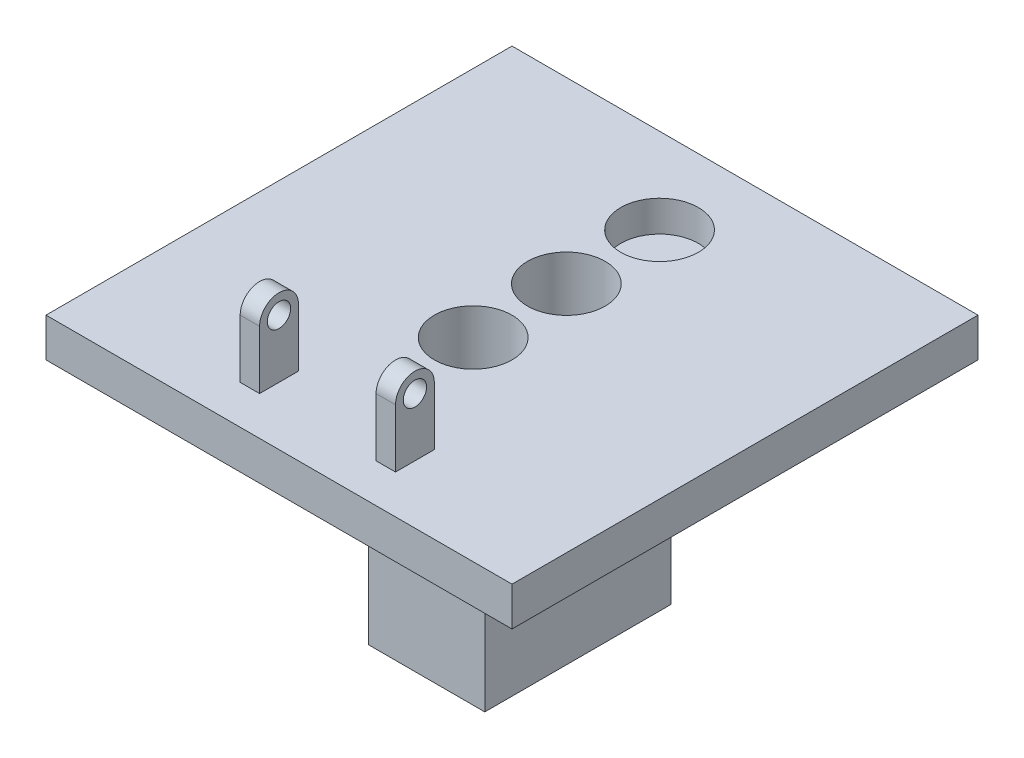
ISO-10303-21;
HEADER;
FILE_DESCRIPTION(('STEP AP214'),'2;1');
FILE_NAME('part.step','',(''),(''),'','','');
FILE_SCHEMA(('AUTOMOTIVE_DESIGN { 1 0 10303 214 1 1 1 1 }'));
ENDSEC;
DATA;
#1=APPLICATION_CONTEXT('core data for automotive mechanical design processes');
#2=APPLICATION_PROTOCOL_DEFINITION('international standard','automotive_design',2000,#1);
#3=PRODUCT_CONTEXT('',#1,'mechanical');
#4=PRODUCT('Part','Part','',(#3));
#5=PRODUCT_RELATED_PRODUCT_CATEGORY('part','',(#4));
#6=PRODUCT_DEFINITION_FORMATION('','',#4);
#7=PRODUCT_DEFINITION_CONTEXT('part definition',#1,'design');
#8=PRODUCT_DEFINITION('design','',#6,#7);
#9=PRODUCT_DEFINITION_SHAPE('','',#8);
#10=(LENGTH_UNIT() NAMED_UNIT(*) SI_UNIT(.MILLI.,.METRE.));
#11=(NAMED_UNIT(*) PLANE_ANGLE_UNIT() SI_UNIT($,.RADIAN.));
#12=(NAMED_UNIT(*) SI_UNIT($,.STERADIAN.) SOLID_ANGLE_UNIT());
#13=UNCERTAINTY_MEASURE_WITH_UNIT(LENGTH_MEASURE(1.E-05),#10,'distance_accuracy_value','');
#14=(GEOMETRIC_REPRESENTATION_CONTEXT(3) GLOBAL_UNCERTAINTY_ASSIGNED_CONTEXT((#13)) GLOBAL_UNIT_ASSIGNED_CONTEXT((#10,
#11,#12)) REPRESENTATION_CONTEXT('',''));
#15=CARTESIAN_POINT('',(0.,0.,0.));
#16=DIRECTION('',(0.,0.,1.));
#17=DIRECTION('',(1.,0.,0.));
#18=AXIS2_PLACEMENT_3D('',#15,#16,#17);
#19=CARTESIAN_POINT('',(0.,0.,0.));
#20=DIRECTION('',(0.,1.,0.));
#21=DIRECTION('',(0.,0.,1.));
#22=AXIS2_PLACEMENT_3D('',#19,#20,#21);
#23=PLANE('',#22);
#24=DIRECTION('',(0.,0.,-1.));
#25=VECTOR('',#24,1.);
#26=CARTESIAN_POINT('',(76.2,0.,-76.2));
#27=LINE('',#26,#25);
#28=CARTESIAN_POINT('',(76.2,0.,76.2));
#29=VERTEX_POINT('',#28);
#30=CARTESIAN_POINT('',(76.2,0.,-76.2));
#31=VERTEX_POINT('',#30);
#32=EDGE_CURVE('E238',#29,#31,#27,.T.);
#33=ORIENTED_EDGE('',*,*,#32,.F.);
#34=DIRECTION('',(1.,0.,0.));
#35=VECTOR('',#34,1.);
#36=CARTESIAN_POINT('',(-76.2,0.,76.2));
#37=LINE('',#36,#35);
#38=CARTESIAN_POINT('',(-76.2,0.,76.2));
#39=VERTEX_POINT('',#38);
#40=EDGE_CURVE('E243',#39,#29,#37,.T.);
#41=ORIENTED_EDGE('',*,*,#40,.F.);
#42=DIRECTION('',(0.,0.,1.));
#43=VECTOR('',#42,1.);
#44=CARTESIAN_POINT('',(-76.2,0.,-76.2));
#45=LINE('',#44,#43);
#46=CARTESIAN_POINT('',(-76.2,0.,-76.2));
#47=VERTEX_POINT('',#46);
#48=EDGE_CURVE('E254',#47,#39,#45,.T.);
#49=ORIENTED_EDGE('',*,*,#48,.F.);
#50=DIRECTION('',(-1.,0.,0.));
#51=VECTOR('',#50,1.);
#52=CARTESIAN_POINT('',(-76.2,0.,-76.2));
#53=LINE('',#52,#51);
#54=EDGE_CURVE('E252',#31,#47,#53,.T.);
#55=ORIENTED_EDGE('',*,*,#54,.F.);
#56=EDGE_LOOP('',(#33,#41,#49,#55));
#57=FACE_BOUND('',#56,.T.);
#58=DIRECTION('',(0.,0.,1.));
#59=VECTOR('',#58,1.);
#60=CARTESIAN_POINT('',(19.05,0.,0.));
#61=LINE('',#60,#59);
#62=CARTESIAN_POINT('',(19.05,0.,-33.02));
#63=VERTEX_POINT('',#62);
#64=CARTESIAN_POINT('',(19.05,0.,27.94));
#65=VERTEX_POINT('',#64);
#66=EDGE_CURVE('E55',#63,#65,#61,.T.);
#67=ORIENTED_EDGE('',*,*,#66,.F.);
#68=DIRECTION('',(1.,0.,0.));
#69=VECTOR('',#68,1.);
#70=CARTESIAN_POINT('',(0.,0.,-33.02));
#71=LINE('',#70,#69);
#72=CARTESIAN_POINT('',(-19.05,0.,-33.02));
#73=VERTEX_POINT('',#72);
#74=EDGE_CURVE('E164',#73,#63,#71,.T.);
#75=ORIENTED_EDGE('',*,*,#74,.F.);
#76=DIRECTION('',(0.,0.,1.));
#77=VECTOR('',#76,1.);
#78=CARTESIAN_POINT('',(-19.05,0.,0.));
#79=LINE('',#78,#77);
#80=CARTESIAN_POINT('',(-19.05,0.,27.94));
#81=VERTEX_POINT('',#80);
#82=EDGE_CURVE('E186',#73,#81,#79,.T.);
#83=ORIENTED_EDGE('',*,*,#82,.T.);
#84=DIRECTION('',(1.,0.,0.));
#85=VECTOR('',#84,1.);
#86=CARTESIAN_POINT('',(0.,0.,27.94));
#87=LINE('',#86,#85);
#88=EDGE_CURVE('E183',#81,#65,#87,.T.);
#89=ORIENTED_EDGE('',*,*,#88,.T.);
#90=EDGE_LOOP('',(#67,#75,#83,#89));
#91=FACE_BOUND('',#90,.T.);
#92=ADVANCED_FACE('F38',(#57,#91),#23,.F.);
#93=CARTESIAN_POINT('',(25.4,31.75,57.15));
#94=DIRECTION('',(-1.,0.,0.));
#95=DIRECTION('',(0.,0.,1.));
#96=AXIS2_PLACEMENT_3D('',#93,#94,#95);
#97=CYLINDRICAL_SURFACE('',#96,6.35);
#98=CARTESIAN_POINT('',(-19.05,31.75,57.15));
#99=DIRECTION('',(-1.,0.,0.));
#100=DIRECTION('',(0.,0.,1.));
#101=AXIS2_PLACEMENT_3D('',#98,#99,#100);
#102=CIRCLE('',#101,6.35);
#103=CARTESIAN_POINT('',(-19.05,31.75,50.8));
#104=VERTEX_POINT('',#103);
#105=CARTESIAN_POINT('',(-19.05,31.75,63.5));
#106=VERTEX_POINT('',#105);
#107=EDGE_CURVE('E212',#104,#106,#102,.F.);
#108=ORIENTED_EDGE('',*,*,#107,.F.);
#109=DIRECTION('',(-1.,0.,0.));
#110=VECTOR('',#109,1.);
#111=CARTESIAN_POINT('',(25.4,31.75,50.8));
#112=LINE('',#111,#110);
#113=CARTESIAN_POINT('',(-25.4,31.75,50.8));
#114=VERTEX_POINT('',#113);
#115=EDGE_CURVE('E273',#114,#104,#112,.F.);
#116=ORIENTED_EDGE('',*,*,#115,.F.);
#117=CARTESIAN_POINT('',(-25.4,31.75,57.15));
#118=DIRECTION('',(-1.,0.,0.));
#119=DIRECTION('',(0.,0.,1.));
#120=AXIS2_PLACEMENT_3D('',#117,#118,#119);
#121=CIRCLE('',#120,6.35);
#122=CARTESIAN_POINT('',(-25.4,31.75,63.5));
#123=VERTEX_POINT('',#122);
#124=EDGE_CURVE('E278',#123,#114,#121,.T.);
#125=ORIENTED_EDGE('',*,*,#124,.F.);
#126=DIRECTION('',(-1.,0.,0.));
#127=VECTOR('',#126,1.);
#128=CARTESIAN_POINT('',(25.4,31.75,63.5));
#129=LINE('',#128,#127);
#130=EDGE_CURVE('E268',#106,#123,#129,.T.);
#131=ORIENTED_EDGE('',*,*,#130,.F.);
#132=EDGE_LOOP('',(#108,#116,#125,#131));
#133=FACE_BOUND('',#132,.T.);
#134=ADVANCED_FACE('F318',(#133),#97,.T.);
#135=CARTESIAN_POINT('',(25.4,12.7,63.5));
#136=DIRECTION('',(0.,0.,-1.));
#137=DIRECTION('',(-1.,0.,0.));
#138=AXIS2_PLACEMENT_3D('',#135,#136,#137);
#139=PLANE('',#138);
#140=DIRECTION('',(-1.,0.,0.));
#141=VECTOR('',#140,1.);
#142=CARTESIAN_POINT('',(25.4,12.7,63.5));
#143=LINE('',#142,#141);
#144=CARTESIAN_POINT('',(-19.05,12.7,63.5));
#145=VERTEX_POINT('',#144);
#146=CARTESIAN_POINT('',(-25.4,12.7,63.5));
#147=VERTEX_POINT('',#146);
#148=EDGE_CURVE('E235',#145,#147,#143,.T.);
#149=ORIENTED_EDGE('',*,*,#148,.F.);
#150=DIRECTION('',(0.,-1.,0.));
#151=VECTOR('',#150,1.);
#152=CARTESIAN_POINT('',(-19.05,12.7,63.5));
#153=LINE('',#152,#151);
#154=EDGE_CURVE('E202',#106,#145,#153,.T.);
#155=ORIENTED_EDGE('',*,*,#154,.F.);
#156=ORIENTED_EDGE('',*,*,#130,.T.);
#157=DIRECTION('',(0.,-1.,0.));
#158=VECTOR('',#157,1.);
#159=CARTESIAN_POINT('',(-25.4,12.7,63.5));
#160=LINE('',#159,#158);
#161=EDGE_CURVE('E214',#123,#147,#160,.T.);
#162=ORIENTED_EDGE('',*,*,#161,.T.);
#163=EDGE_LOOP('',(#149,#155,#156,#162));
#164=FACE_BOUND('',#163,.T.);
#165=ADVANCED_FACE('F324',(#164),#139,.F.);
#166=CARTESIAN_POINT('',(25.4,12.7,50.8));
#167=DIRECTION('',(0.,0.,1.));
#168=DIRECTION('',(1.,0.,0.));
#169=AXIS2_PLACEMENT_3D('',#166,#167,#168);
#170=PLANE('',#169);
#171=ORIENTED_EDGE('',*,*,#115,.T.);
#172=DIRECTION('',(0.,-1.,0.));
#173=VECTOR('',#172,1.);
#174=CARTESIAN_POINT('',(-19.05,12.7,50.8));
#175=LINE('',#174,#173);
#176=CARTESIAN_POINT('',(-19.05,12.7,50.8));
#177=VERTEX_POINT('',#176);
#178=EDGE_CURVE('E11',#104,#177,#175,.T.);
#179=ORIENTED_EDGE('',*,*,#178,.T.);
#180=DIRECTION('',(-1.,0.,0.));
#181=VECTOR('',#180,1.);
#182=CARTESIAN_POINT('',(25.4,12.7,50.8));
#183=LINE('',#182,#181);
#184=CARTESIAN_POINT('',(-25.4,12.7,50.8));
#185=VERTEX_POINT('',#184);
#186=EDGE_CURVE('E224',#177,#185,#183,.T.);
#187=ORIENTED_EDGE('',*,*,#186,.T.);
#188=DIRECTION('',(0.,1.,0.));
#189=VECTOR('',#188,1.);
#190=CARTESIAN_POINT('',(-25.4,12.7,50.8));
#191=LINE('',#190,#189);
#192=EDGE_CURVE('E218',#185,#114,#191,.T.);
#193=ORIENTED_EDGE('',*,*,#192,.T.);
#194=EDGE_LOOP('',(#171,#179,#187,#193));
#195=FACE_BOUND('',#194,.T.);
#196=ADVANCED_FACE('F361',(#195),#170,.F.);
#197=CARTESIAN_POINT('',(19.05,31.75,57.15));
#198=DIRECTION('',(1.,0.,0.));
#199=DIRECTION('',(0.,0.,-1.));
#200=AXIS2_PLACEMENT_3D('',#197,#198,#199);
#201=CIRCLE('',#200,6.35);
#202=CARTESIAN_POINT('',(19.05,31.75,63.5));
#203=VERTEX_POINT('',#202);
#204=CARTESIAN_POINT('',(19.05,31.75,50.8));
#205=VERTEX_POINT('',#204);
#206=EDGE_CURVE('E208',#203,#205,#201,.F.);
#207=ORIENTED_EDGE('',*,*,#206,.F.);
#208=CARTESIAN_POINT('',(25.4,31.75,63.5));
#209=VERTEX_POINT('',#208);
#210=EDGE_CURVE('E269',#209,#203,#129,.T.);
#211=ORIENTED_EDGE('',*,*,#210,.F.);
#212=CARTESIAN_POINT('',(25.4,31.75,57.15));
#213=DIRECTION('',(-1.,0.,0.));
#214=DIRECTION('',(0.,0.,1.));
#215=AXIS2_PLACEMENT_3D('',#212,#213,#214);
#216=CIRCLE('',#215,6.35);
#217=CARTESIAN_POINT('',(25.4,31.75,50.8));
#218=VERTEX_POINT('',#217);
#219=EDGE_CURVE('E276',#218,#209,#216,.F.);
#220=ORIENTED_EDGE('',*,*,#219,.F.);
#221=EDGE_CURVE('E272',#205,#218,#112,.F.);
#222=ORIENTED_EDGE('',*,*,#221,.F.);
#223=EDGE_LOOP('',(#207,#211,#220,#222));
#224=FACE_BOUND('',#223,.T.);
#225=ADVANCED_FACE('F41',(#224),#97,.T.);
#226=CARTESIAN_POINT('',(0.,12.7,0.));
#227=DIRECTION('',(0.,1.,0.));
#228=DIRECTION('',(0.,0.,1.));
#229=AXIS2_PLACEMENT_3D('',#226,#227,#228);
#230=PLANE('',#229);
#231=CARTESIAN_POINT('',(0.,12.7,-48.26));
#232=DIRECTION('',(0.,1.,0.));
#233=DIRECTION('',(0.,0.,1.));
#234=AXIS2_PLACEMENT_3D('',#231,#232,#233);
#235=CIRCLE('',#234,12.7);
#236=CARTESIAN_POINT('',(0.,12.7,-35.56));
#237=VERTEX_POINT('',#236);
#238=EDGE_CURVE('E365',#237,#237,#235,.T.);
#239=ORIENTED_EDGE('',*,*,#238,.F.);
#240=EDGE_LOOP('',(#239));
#241=FACE_BOUND('',#240,.T.);
#242=CARTESIAN_POINT('',(0.,12.7,-17.78));
#243=DIRECTION('',(0.,1.,0.));
#244=DIRECTION('',(0.,0.,1.));
#245=AXIS2_PLACEMENT_3D('',#242,#243,#244);
#246=CIRCLE('',#245,12.7);
#247=CARTESIAN_POINT('',(0.,12.7,-5.08000000000002));
#248=VERTEX_POINT('',#247);
#249=EDGE_CURVE('E369',#248,#248,#246,.T.);
#250=ORIENTED_EDGE('',*,*,#249,.F.);
#251=EDGE_LOOP('',(#250));
#252=FACE_BOUND('',#251,.T.);
#253=CARTESIAN_POINT('',(0.,12.7,12.7));
#254=DIRECTION('',(0.,1.,0.));
#255=DIRECTION('',(0.,0.,1.));
#256=AXIS2_PLACEMENT_3D('',#253,#254,#255);
#257=CIRCLE('',#256,12.7);
#258=CARTESIAN_POINT('',(0.,12.7,25.4));
#259=VERTEX_POINT('',#258);
#260=EDGE_CURVE('E373',#259,#259,#257,.T.);
#261=ORIENTED_EDGE('',*,*,#260,.F.);
#262=EDGE_LOOP('',(#261));
#263=FACE_BOUND('',#262,.T.);
#264=ORIENTED_EDGE('',*,*,#186,.F.);
#265=DIRECTION('',(0.,0.,1.));
#266=VECTOR('',#265,1.);
#267=CARTESIAN_POINT('',(-19.05,12.7,12.7));
#268=LINE('',#267,#266);
#269=EDGE_CURVE('E206',#177,#145,#268,.T.);
#270=ORIENTED_EDGE('',*,*,#269,.T.);
#271=ORIENTED_EDGE('',*,*,#148,.T.);
#272=DIRECTION('',(0.,0.,-1.));
#273=VECTOR('',#272,1.);
#274=CARTESIAN_POINT('',(-25.4,12.7,63.5));
#275=LINE('',#274,#273);
#276=EDGE_CURVE('E227',#147,#185,#275,.T.);
#277=ORIENTED_EDGE('',*,*,#276,.T.);
#278=EDGE_LOOP('',(#264,#270,#271,#277));
#279=FACE_BOUND('',#278,.T.);
#280=DIRECTION('',(0.,0.,1.));
#281=VECTOR('',#280,1.);
#282=CARTESIAN_POINT('',(19.05,12.7,12.7));
#283=LINE('',#282,#281);
#284=CARTESIAN_POINT('',(19.05,12.7,50.8));
#285=VERTEX_POINT('',#284);
#286=CARTESIAN_POINT('',(19.05,12.7,63.5));
#287=VERTEX_POINT('',#286);
#288=EDGE_CURVE('E63',#285,#287,#283,.T.);
#289=ORIENTED_EDGE('',*,*,#288,.F.);
#290=CARTESIAN_POINT('',(25.4,12.7,50.8));
#291=VERTEX_POINT('',#290);
#292=EDGE_CURVE('E232',#291,#285,#183,.T.);
#293=ORIENTED_EDGE('',*,*,#292,.F.);
#294=DIRECTION('',(0.,0.,-1.));
#295=VECTOR('',#294,1.);
#296=CARTESIAN_POINT('',(25.4,12.7,63.5));
#297=LINE('',#296,#295);
#298=CARTESIAN_POINT('',(25.4,12.7,63.5));
#299=VERTEX_POINT('',#298);
#300=EDGE_CURVE('E217',#299,#291,#297,.T.);
#301=ORIENTED_EDGE('',*,*,#300,.F.);
#302=EDGE_CURVE('E236',#299,#287,#143,.T.);
#303=ORIENTED_EDGE('',*,*,#302,.T.);
#304=EDGE_LOOP('',(#289,#293,#301,#303));
#305=FACE_BOUND('',#304,.T.);
#306=DIRECTION('',(0.,0.,-1.));
#307=VECTOR('',#306,1.);
#308=CARTESIAN_POINT('',(76.2,12.7,-76.2));
#309=LINE('',#308,#307);
#310=CARTESIAN_POINT('',(76.2,12.7,76.2));
#311=VERTEX_POINT('',#310);
#312=CARTESIAN_POINT('',(76.2,12.7,-76.2));
#313=VERTEX_POINT('',#312);
#314=EDGE_CURVE('E239',#311,#313,#309,.T.);
#315=ORIENTED_EDGE('',*,*,#314,.T.);
#316=DIRECTION('',(-1.,0.,0.));
#317=VECTOR('',#316,1.);
#318=CARTESIAN_POINT('',(-76.2,12.7,-76.2));
#319=LINE('',#318,#317);
#320=CARTESIAN_POINT('',(-76.2,12.7,-76.2));
#321=VERTEX_POINT('',#320);
#322=EDGE_CURVE('E242',#313,#321,#319,.T.);
#323=ORIENTED_EDGE('',*,*,#322,.T.);
#324=DIRECTION('',(0.,0.,1.));
#325=VECTOR('',#324,1.);
#326=CARTESIAN_POINT('',(-76.2,12.7,-76.2));
#327=LINE('',#326,#325);
#328=CARTESIAN_POINT('',(-76.2,12.7,76.2));
#329=VERTEX_POINT('',#328);
#330=EDGE_CURVE('E245',#321,#329,#327,.T.);
#331=ORIENTED_EDGE('',*,*,#330,.T.);
#332=DIRECTION('',(1.,0.,0.));
#333=VECTOR('',#332,1.);
#334=CARTESIAN_POINT('',(-76.2,12.7,76.2));
#335=LINE('',#334,#333);
#336=EDGE_CURVE('E247',#329,#311,#335,.T.);
#337=ORIENTED_EDGE('',*,*,#336,.T.);
#338=EDGE_LOOP('',(#315,#323,#331,#337));
#339=FACE_BOUND('',#338,.T.);
#340=ADVANCED_FACE('F295',(#241,#252,#263,#279,#305,#339),#230,.T.);
#341=CARTESIAN_POINT('',(76.2,12.7,-76.2));
#342=DIRECTION('',(-1.,0.,0.));
#343=DIRECTION('',(0.,0.,1.));
#344=AXIS2_PLACEMENT_3D('',#341,#342,#343);
#345=PLANE('',#344);
#346=ORIENTED_EDGE('',*,*,#32,.T.);
#347=DIRECTION('',(0.,-1.,0.));
#348=VECTOR('',#347,1.);
#349=CARTESIAN_POINT('',(76.2,12.7,-76.2));
#350=LINE('',#349,#348);
#351=EDGE_CURVE('E265',#313,#31,#350,.T.);
#352=ORIENTED_EDGE('',*,*,#351,.F.);
#353=ORIENTED_EDGE('',*,*,#314,.F.);
#354=DIRECTION('',(0.,-1.,0.));
#355=VECTOR('',#354,1.);
#356=CARTESIAN_POINT('',(76.2,12.7,76.2));
#357=LINE('',#356,#355);
#358=EDGE_CURVE('E249',#311,#29,#357,.T.);
#359=ORIENTED_EDGE('',*,*,#358,.T.);
#360=EDGE_LOOP('',(#346,#352,#353,#359));
#361=FACE_BOUND('',#360,.T.);
#362=ADVANCED_FACE('F341',(#361),#345,.F.);
#363=CARTESIAN_POINT('',(-76.2,12.7,-76.2));
#364=DIRECTION('',(0.,0.,1.));
#365=DIRECTION('',(1.,0.,0.));
#366=AXIS2_PLACEMENT_3D('',#363,#364,#365);
#367=PLANE('',#366);
#368=ORIENTED_EDGE('',*,*,#54,.T.);
#369=DIRECTION('',(0.,-1.,0.));
#370=VECTOR('',#369,1.);
#371=CARTESIAN_POINT('',(-76.2,12.7,-76.2));
#372=LINE('',#371,#370);
#373=EDGE_CURVE('E262',#321,#47,#372,.T.);
#374=ORIENTED_EDGE('',*,*,#373,.F.);
#375=ORIENTED_EDGE('',*,*,#322,.F.);
#376=ORIENTED_EDGE('',*,*,#351,.T.);
#377=EDGE_LOOP('',(#368,#374,#375,#376));
#378=FACE_BOUND('',#377,.T.);
#379=ADVANCED_FACE('F338',(#378),#367,.F.);
#380=CARTESIAN_POINT('',(-76.2,12.7,-76.2));
#381=DIRECTION('',(1.,0.,0.));
#382=DIRECTION('',(0.,0.,-1.));
#383=AXIS2_PLACEMENT_3D('',#380,#381,#382);
#384=PLANE('',#383);
#385=ORIENTED_EDGE('',*,*,#48,.T.);
#386=DIRECTION('',(0.,-1.,0.));
#387=VECTOR('',#386,1.);
#388=CARTESIAN_POINT('',(-76.2,12.7,76.2));
#389=LINE('',#388,#387);
#390=EDGE_CURVE('E259',#329,#39,#389,.T.);
#391=ORIENTED_EDGE('',*,*,#390,.F.);
#392=ORIENTED_EDGE('',*,*,#330,.F.);
#393=ORIENTED_EDGE('',*,*,#373,.T.);
#394=EDGE_LOOP('',(#385,#391,#392,#393));
#395=FACE_BOUND('',#394,.T.);
#396=ADVANCED_FACE('F334',(#395),#384,.F.);
#397=CARTESIAN_POINT('',(-76.2,12.7,76.2));
#398=DIRECTION('',(0.,0.,-1.));
#399=DIRECTION('',(-1.,0.,0.));
#400=AXIS2_PLACEMENT_3D('',#397,#398,#399);
#401=PLANE('',#400);
#402=ORIENTED_EDGE('',*,*,#40,.T.);
#403=ORIENTED_EDGE('',*,*,#358,.F.);
#404=ORIENTED_EDGE('',*,*,#336,.F.);
#405=ORIENTED_EDGE('',*,*,#390,.T.);
#406=EDGE_LOOP('',(#402,#403,#404,#405));
#407=FACE_BOUND('',#406,.T.);
#408=ADVANCED_FACE('F331',(#407),#401,.F.);
#409=ORIENTED_EDGE('',*,*,#210,.T.);
#410=DIRECTION('',(0.,1.,0.));
#411=VECTOR('',#410,1.);
#412=CARTESIAN_POINT('',(19.05,12.7,63.5));
#413=LINE('',#412,#411);
#414=EDGE_CURVE('E204',#287,#203,#413,.T.);
#415=ORIENTED_EDGE('',*,*,#414,.F.);
#416=ORIENTED_EDGE('',*,*,#302,.F.);
#417=DIRECTION('',(0.,-1.,0.));
#418=VECTOR('',#417,1.);
#419=CARTESIAN_POINT('',(25.4,12.7,63.5));
#420=LINE('',#419,#418);
#421=EDGE_CURVE('E215',#209,#299,#420,.T.);
#422=ORIENTED_EDGE('',*,*,#421,.F.);
#423=EDGE_LOOP('',(#409,#415,#416,#422));
#424=FACE_BOUND('',#423,.T.);
#425=ADVANCED_FACE('F299',(#424),#139,.F.);
#426=ORIENTED_EDGE('',*,*,#292,.T.);
#427=DIRECTION('',(0.,1.,0.));
#428=VECTOR('',#427,1.);
#429=CARTESIAN_POINT('',(19.05,12.7,50.8));
#430=LINE('',#429,#428);
#431=EDGE_CURVE('E48',#285,#205,#430,.T.);
#432=ORIENTED_EDGE('',*,*,#431,.T.);
#433=ORIENTED_EDGE('',*,*,#221,.T.);
#434=DIRECTION('',(0.,1.,0.));
#435=VECTOR('',#434,1.);
#436=CARTESIAN_POINT('',(25.4,12.7,50.8));
#437=LINE('',#436,#435);
#438=EDGE_CURVE('E221',#291,#218,#437,.T.);
#439=ORIENTED_EDGE('',*,*,#438,.F.);
#440=EDGE_LOOP('',(#426,#432,#433,#439));
#441=FACE_BOUND('',#440,.T.);
#442=ADVANCED_FACE('F283',(#441),#170,.F.);
#443=CARTESIAN_POINT('',(25.4,0.,0.));
#444=DIRECTION('',(-1.,0.,0.));
#445=DIRECTION('',(0.,0.,1.));
#446=AXIS2_PLACEMENT_3D('',#443,#444,#445);
#447=PLANE('',#446);
#448=CARTESIAN_POINT('',(25.4,31.75,57.15));
#449=DIRECTION('',(1.,0.,0.));
#450=DIRECTION('',(0.,0.,-1.));
#451=AXIS2_PLACEMENT_3D('',#448,#449,#450);
#452=CIRCLE('',#451,3.81);
#453=CARTESIAN_POINT('',(25.4,31.75,53.34));
#454=VERTEX_POINT('',#453);
#455=EDGE_CURVE('E171',#454,#454,#452,.T.);
#456=ORIENTED_EDGE('',*,*,#455,.F.);
#457=EDGE_LOOP('',(#456));
#458=FACE_BOUND('',#457,.T.);
#459=ORIENTED_EDGE('',*,*,#438,.T.);
#460=ORIENTED_EDGE('',*,*,#219,.T.);
#461=ORIENTED_EDGE('',*,*,#421,.T.);
#462=ORIENTED_EDGE('',*,*,#300,.T.);
#463=EDGE_LOOP('',(#459,#460,#461,#462));
#464=FACE_BOUND('',#463,.T.);
#465=ADVANCED_FACE('F292',(#458,#464),#447,.F.);
#466=CARTESIAN_POINT('',(-25.4,0.,0.));
#467=DIRECTION('',(-1.,0.,0.));
#468=DIRECTION('',(0.,0.,1.));
#469=AXIS2_PLACEMENT_3D('',#466,#467,#468);
#470=PLANE('',#469);
#471=CARTESIAN_POINT('',(-25.4,31.75,57.15));
#472=DIRECTION('',(1.,0.,0.));
#473=DIRECTION('',(0.,0.,-1.));
#474=AXIS2_PLACEMENT_3D('',#471,#472,#473);
#475=CIRCLE('',#474,3.81);
#476=CARTESIAN_POINT('',(-25.4,31.75,53.34));
#477=VERTEX_POINT('',#476);
#478=EDGE_CURVE('E194',#477,#477,#475,.T.);
#479=ORIENTED_EDGE('',*,*,#478,.T.);
#480=EDGE_LOOP('',(#479));
#481=FACE_BOUND('',#480,.T.);
#482=ORIENTED_EDGE('',*,*,#161,.F.);
#483=ORIENTED_EDGE('',*,*,#124,.T.);
#484=ORIENTED_EDGE('',*,*,#192,.F.);
#485=ORIENTED_EDGE('',*,*,#276,.F.);
#486=EDGE_LOOP('',(#482,#483,#484,#485));
#487=FACE_BOUND('',#486,.T.);
#488=ADVANCED_FACE('F313',(#481,#487),#470,.T.);
#489=CARTESIAN_POINT('',(-19.05,12.7,12.7));
#490=DIRECTION('',(-1.,0.,0.));
#491=DIRECTION('',(0.,0.,1.));
#492=AXIS2_PLACEMENT_3D('',#489,#490,#491);
#493=PLANE('',#492);
#494=CARTESIAN_POINT('',(-19.05,31.75,57.15));
#495=DIRECTION('',(-1.,0.,0.));
#496=DIRECTION('',(0.,0.,1.));
#497=AXIS2_PLACEMENT_3D('',#494,#495,#496);
#498=CIRCLE('',#497,3.81);
#499=CARTESIAN_POINT('',(-19.05,31.75,60.96));
#500=VERTEX_POINT('',#499);
#501=EDGE_CURVE('E199',#500,#500,#498,.T.);
#502=ORIENTED_EDGE('',*,*,#501,.T.);
#503=EDGE_LOOP('',(#502));
#504=FACE_BOUND('',#503,.T.);
#505=ORIENTED_EDGE('',*,*,#107,.T.);
#506=ORIENTED_EDGE('',*,*,#154,.T.);
#507=ORIENTED_EDGE('',*,*,#269,.F.);
#508=ORIENTED_EDGE('',*,*,#178,.F.);
#509=EDGE_LOOP('',(#505,#506,#507,#508));
#510=FACE_BOUND('',#509,.T.);
#511=ADVANCED_FACE('F303',(#504,#510),#493,.F.);
#512=CARTESIAN_POINT('',(19.05,12.7,12.7));
#513=DIRECTION('',(1.,0.,0.));
#514=DIRECTION('',(0.,0.,-1.));
#515=AXIS2_PLACEMENT_3D('',#512,#513,#514);
#516=PLANE('',#515);
#517=CARTESIAN_POINT('',(19.05,31.75,57.15));
#518=DIRECTION('',(1.,0.,0.));
#519=DIRECTION('',(0.,0.,-1.));
#520=AXIS2_PLACEMENT_3D('',#517,#518,#519);
#521=CIRCLE('',#520,3.81);
#522=CARTESIAN_POINT('',(19.05,31.75,53.34));
#523=VERTEX_POINT('',#522);
#524=EDGE_CURVE('E43',#523,#523,#521,.T.);
#525=ORIENTED_EDGE('',*,*,#524,.T.);
#526=EDGE_LOOP('',(#525));
#527=FACE_BOUND('',#526,.T.);
#528=ORIENTED_EDGE('',*,*,#206,.T.);
#529=ORIENTED_EDGE('',*,*,#431,.F.);
#530=ORIENTED_EDGE('',*,*,#288,.T.);
#531=ORIENTED_EDGE('',*,*,#414,.T.);
#532=EDGE_LOOP('',(#528,#529,#530,#531));
#533=FACE_BOUND('',#532,.T.);
#534=ADVANCED_FACE('F300',(#527,#533),#516,.F.);
#535=CARTESIAN_POINT('',(-25.4,31.75,57.15));
#536=DIRECTION('',(1.,0.,0.));
#537=DIRECTION('',(0.,0.,-1.));
#538=AXIS2_PLACEMENT_3D('',#535,#536,#537);
#539=CYLINDRICAL_SURFACE('',#538,3.81);
#540=ORIENTED_EDGE('',*,*,#455,.T.);
#541=EDGE_LOOP('',(#540));
#542=FACE_BOUND('',#541,.T.);
#543=ORIENTED_EDGE('',*,*,#524,.F.);
#544=EDGE_LOOP('',(#543));
#545=FACE_BOUND('',#544,.T.);
#546=ADVANCED_FACE('F302',(#542,#545),#539,.F.);
#547=ORIENTED_EDGE('',*,*,#478,.F.);
#548=EDGE_LOOP('',(#547));
#549=FACE_BOUND('',#548,.T.);
#550=ORIENTED_EDGE('',*,*,#501,.F.);
#551=EDGE_LOOP('',(#550));
#552=FACE_BOUND('',#551,.T.);
#553=ADVANCED_FACE('F310',(#549,#552),#539,.F.);
#554=CARTESIAN_POINT('',(19.05,-76.2,0.));
#555=DIRECTION('',(-1.,0.,0.));
#556=DIRECTION('',(0.,0.,1.));
#557=AXIS2_PLACEMENT_3D('',#554,#555,#556);
#558=PLANE('',#557);
#559=ORIENTED_EDGE('',*,*,#66,.T.);
#560=DIRECTION('',(0.,1.,0.));
#561=VECTOR('',#560,1.);
#562=CARTESIAN_POINT('',(19.05,-76.2,27.94));
#563=LINE('',#562,#561);
#564=CARTESIAN_POINT('',(19.05,-76.2,27.94));
#565=VERTEX_POINT('',#564);
#566=EDGE_CURVE('E166',#565,#65,#563,.T.);
#567=ORIENTED_EDGE('',*,*,#566,.F.);
#568=DIRECTION('',(0.,0.,1.));
#569=VECTOR('',#568,1.);
#570=CARTESIAN_POINT('',(19.05,-76.2,0.));
#571=LINE('',#570,#569);
#572=CARTESIAN_POINT('',(19.05,-76.2,-33.02));
#573=VERTEX_POINT('',#572);
#574=EDGE_CURVE('E155',#573,#565,#571,.T.);
#575=ORIENTED_EDGE('',*,*,#574,.F.);
#576=DIRECTION('',(0.,1.,0.));
#577=VECTOR('',#576,1.);
#578=CARTESIAN_POINT('',(19.05,-76.2,-33.02));
#579=LINE('',#578,#577);
#580=EDGE_CURVE('E181',#573,#63,#579,.T.);
#581=ORIENTED_EDGE('',*,*,#580,.T.);
#582=EDGE_LOOP('',(#559,#567,#575,#581));
#583=FACE_BOUND('',#582,.T.);
#584=ADVANCED_FACE('F167',(#583),#558,.F.);
#585=CARTESIAN_POINT('',(0.,-76.2,27.94));
#586=DIRECTION('',(0.,0.,1.));
#587=DIRECTION('',(1.,0.,0.));
#588=AXIS2_PLACEMENT_3D('',#585,#586,#587);
#589=PLANE('',#588);
#590=ORIENTED_EDGE('',*,*,#88,.F.);
#591=DIRECTION('',(0.,1.,0.));
#592=VECTOR('',#591,1.);
#593=CARTESIAN_POINT('',(-19.05,-76.2,27.94));
#594=LINE('',#593,#592);
#595=CARTESIAN_POINT('',(-19.05,-76.2,27.94));
#596=VERTEX_POINT('',#595);
#597=EDGE_CURVE('E172',#596,#81,#594,.T.);
#598=ORIENTED_EDGE('',*,*,#597,.F.);
#599=DIRECTION('',(1.,0.,0.));
#600=VECTOR('',#599,1.);
#601=CARTESIAN_POINT('',(0.,-76.2,27.94));
#602=LINE('',#601,#600);
#603=EDGE_CURVE('E159',#596,#565,#602,.T.);
#604=ORIENTED_EDGE('',*,*,#603,.T.);
#605=ORIENTED_EDGE('',*,*,#566,.T.);
#606=EDGE_LOOP('',(#590,#598,#604,#605));
#607=FACE_BOUND('',#606,.T.);
#608=ADVANCED_FACE('F174',(#607),#589,.T.);
#609=CARTESIAN_POINT('',(-19.05,-76.2,0.));
#610=DIRECTION('',(-1.,0.,0.));
#611=DIRECTION('',(0.,0.,1.));
#612=AXIS2_PLACEMENT_3D('',#609,#610,#611);
#613=PLANE('',#612);
#614=ORIENTED_EDGE('',*,*,#82,.F.);
#615=DIRECTION('',(0.,1.,0.));
#616=VECTOR('',#615,1.);
#617=CARTESIAN_POINT('',(-19.05,-76.2,-33.02));
#618=LINE('',#617,#616);
#619=CARTESIAN_POINT('',(-19.05,-76.2,-33.02));
#620=VERTEX_POINT('',#619);
#621=EDGE_CURVE('E191',#620,#73,#618,.T.);
#622=ORIENTED_EDGE('',*,*,#621,.F.);
#623=DIRECTION('',(0.,0.,1.));
#624=VECTOR('',#623,1.);
#625=CARTESIAN_POINT('',(-19.05,-76.2,0.));
#626=LINE('',#625,#624);
#627=EDGE_CURVE('E175',#620,#596,#626,.T.);
#628=ORIENTED_EDGE('',*,*,#627,.T.);
#629=ORIENTED_EDGE('',*,*,#597,.T.);
#630=EDGE_LOOP('',(#614,#622,#628,#629));
#631=FACE_BOUND('',#630,.T.);
#632=ADVANCED_FACE('F478',(#631),#613,.T.);
#633=CARTESIAN_POINT('',(0.,-76.2,-33.02));
#634=DIRECTION('',(0.,0.,1.));
#635=DIRECTION('',(1.,0.,0.));
#636=AXIS2_PLACEMENT_3D('',#633,#634,#635);
#637=PLANE('',#636);
#638=ORIENTED_EDGE('',*,*,#74,.T.);
#639=ORIENTED_EDGE('',*,*,#580,.F.);
#640=DIRECTION('',(1.,0.,0.));
#641=VECTOR('',#640,1.);
#642=CARTESIAN_POINT('',(0.,-76.2,-33.02));
#643=LINE('',#642,#641);
#644=EDGE_CURVE('E162',#620,#573,#643,.T.);
#645=ORIENTED_EDGE('',*,*,#644,.F.);
#646=ORIENTED_EDGE('',*,*,#621,.T.);
#647=EDGE_LOOP('',(#638,#639,#645,#646));
#648=FACE_BOUND('',#647,.T.);
#649=ADVANCED_FACE('F487',(#648),#637,.F.);
#650=CARTESIAN_POINT('',(0.,-76.2,0.));
#651=DIRECTION('',(0.,-1.,0.));
#652=DIRECTION('',(0.,0.,-1.));
#653=AXIS2_PLACEMENT_3D('',#650,#651,#652);
#654=PLANE('',#653);
#655=ORIENTED_EDGE('',*,*,#574,.T.);
#656=ORIENTED_EDGE('',*,*,#603,.F.);
#657=ORIENTED_EDGE('',*,*,#627,.F.);
#658=ORIENTED_EDGE('',*,*,#644,.T.);
#659=EDGE_LOOP('',(#655,#656,#657,#658));
#660=FACE_BOUND('',#659,.T.);
#661=ADVANCED_FACE('F156',(#660),#654,.T.);
#662=CARTESIAN_POINT('',(0.,-63.5,12.7));
#663=DIRECTION('',(0.,1.,0.));
#664=DIRECTION('',(0.,0.,1.));
#665=AXIS2_PLACEMENT_3D('',#662,#663,#664);
#666=CYLINDRICAL_SURFACE('',#665,12.7);
#667=CARTESIAN_POINT('',(0.,-63.5,12.7));
#668=DIRECTION('',(0.,1.,0.));
#669=DIRECTION('',(0.,0.,1.));
#670=AXIS2_PLACEMENT_3D('',#667,#668,#669);
#671=CIRCLE('',#670,12.7);
#672=CARTESIAN_POINT('',(0.,-63.5,25.4));
#673=VERTEX_POINT('',#672);
#674=EDGE_CURVE('E579',#673,#673,#671,.T.);
#675=CARTESIAN_POINT('',(0.,-63.5,25.4));
#676=CARTESIAN_POINT('',(0.,-62.70625,25.4));
#677=CARTESIAN_POINT('',(0.,-61.9125,25.4));
#678=CARTESIAN_POINT('',(0.,-60.325,25.4));
#679=CARTESIAN_POINT('',(0.,-59.53125,25.4));
#680=CARTESIAN_POINT('',(0.,-57.94375,25.4));
#681=CARTESIAN_POINT('',(0.,-57.15,25.4));
#682=CARTESIAN_POINT('',(0.,-55.5625,25.4));
#683=CARTESIAN_POINT('',(0.,-54.76875,25.4));
#684=CARTESIAN_POINT('',(0.,-53.18125,25.4));
#685=CARTESIAN_POINT('',(0.,-52.3875,25.4));
#686=CARTESIAN_POINT('',(0.,-50.8,25.4));
#687=CARTESIAN_POINT('',(0.,-50.00625,25.4));
#688=CARTESIAN_POINT('',(0.,-48.41875,25.4));
#689=CARTESIAN_POINT('',(0.,-47.625,25.4));
#690=CARTESIAN_POINT('',(0.,-46.0375,25.4));
#691=CARTESIAN_POINT('',(0.,-45.24375,25.4));
#692=CARTESIAN_POINT('',(0.,-43.65625,25.4));
#693=CARTESIAN_POINT('',(0.,-42.8625,25.4));
#694=CARTESIAN_POINT('',(0.,-41.275,25.4));
#695=CARTESIAN_POINT('',(0.,-40.48125,25.4));
#696=CARTESIAN_POINT('',(0.,-38.89375,25.4));
#697=CARTESIAN_POINT('',(0.,-38.1,25.4));
#698=CARTESIAN_POINT('',(0.,-36.5125,25.4));
#699=CARTESIAN_POINT('',(0.,-35.71875,25.4));
#700=CARTESIAN_POINT('',(0.,-34.13125,25.4));
#701=CARTESIAN_POINT('',(0.,-33.3375,25.4));
#702=CARTESIAN_POINT('',(0.,-31.75,25.4));
#703=CARTESIAN_POINT('',(0.,-30.95625,25.4));
#704=CARTESIAN_POINT('',(0.,-29.36875,25.4));
#705=CARTESIAN_POINT('',(0.,-28.575,25.4));
#706=CARTESIAN_POINT('',(0.,-26.9875,25.4));
#707=CARTESIAN_POINT('',(0.,-26.19375,25.4));
#708=CARTESIAN_POINT('',(0.,-24.60625,25.4));
#709=CARTESIAN_POINT('',(0.,-23.8125,25.4));
#710=CARTESIAN_POINT('',(0.,-22.225,25.4));
#711=CARTESIAN_POINT('',(0.,-21.43125,25.4));
#712=CARTESIAN_POINT('',(0.,-19.84375,25.4));
#713=CARTESIAN_POINT('',(0.,-19.05,25.4));
#714=CARTESIAN_POINT('',(0.,-17.4625,25.4));
#715=CARTESIAN_POINT('',(0.,-16.66875,25.4));
#716=CARTESIAN_POINT('',(0.,-15.08125,25.4));
#717=CARTESIAN_POINT('',(0.,-14.2875,25.4));
#718=CARTESIAN_POINT('',(0.,-12.7,25.4));
#719=CARTESIAN_POINT('',(0.,-11.90625,25.4));
#720=CARTESIAN_POINT('',(0.,-10.31875,25.4));
#721=CARTESIAN_POINT('',(0.,-9.52499999999999,25.4));
#722=CARTESIAN_POINT('',(0.,-7.93749999999999,25.4));
#723=CARTESIAN_POINT('',(0.,-7.14374999999999,25.4));
#724=CARTESIAN_POINT('',(0.,-5.55624999999999,25.4));
#725=CARTESIAN_POINT('',(0.,-4.76249999999999,25.4));
#726=CARTESIAN_POINT('',(0.,-3.17499999999999,25.4));
#727=CARTESIAN_POINT('',(0.,-2.38124999999999,25.4));
#728=CARTESIAN_POINT('',(0.,-0.793749999999996,25.4));
#729=CARTESIAN_POINT('',(0.,0.,25.4));
#730=CARTESIAN_POINT('',(0.,1.5875,25.4));
#731=CARTESIAN_POINT('',(0.,2.38125,25.4));
#732=CARTESIAN_POINT('',(0.,3.96875,25.4));
#733=CARTESIAN_POINT('',(0.,4.7625,25.4));
#734=CARTESIAN_POINT('',(0.,6.35,25.4));
#735=CARTESIAN_POINT('',(0.,7.14375,25.4));
#736=CARTESIAN_POINT('',(0.,8.73125,25.4));
#737=CARTESIAN_POINT('',(0.,9.525,25.4));
#738=CARTESIAN_POINT('',(0.,11.1125,25.4));
#739=CARTESIAN_POINT('',(0.,11.90625,25.4));
#740=CARTESIAN_POINT('',(0.,12.7,25.4));
#741=B_SPLINE_CURVE_WITH_KNOTS('',3,(#675,#676,#677,#678,#679,#680,#681,#682,#683,#684,#685,
#686,#687,#688,#689,#690,#691,#692,#693,#694,#695,#696,#697,#698,#699,#700,#701,#702,#703,#704,
#705,#706,#707,#708,#709,#710,#711,#712,#713,#714,#715,#716,#717,#718,#719,#720,#721,#722,#723,
#724,#725,#726,#727,#728,#729,#730,#731,#732,#733,#734,#735,#736,#737,#738,#739,#740),
.UNSPECIFIED.,.F.,.F.,(4,2,2,2,2,2,2,2,2,2,2,2,2,2,2,2,2,2,2,2,2,2,2,2,2,2,2,2,2,2,2,2,4),(0.,
2.38125000000001,4.76250000000001,7.14375000000001,9.52500000000001,11.90625,14.2875,16.66875,
19.05,21.43125,23.8125,26.19375,28.575,30.95625,33.3375,35.71875,38.1,40.48125,42.8625,45.24375,
47.625,50.00625,52.3875,54.76875,57.15,59.53125,61.9125,64.29375,66.675,69.05625,71.4375,
73.81875,76.2),.UNSPECIFIED.);
#742=EDGE_CURVE('BSEAM507',#673,#259,#741,.T.);
#743=ORIENTED_EDGE('',*,*,#674,.F.);
#744=ORIENTED_EDGE('',*,*,#260,.T.);
#745=ORIENTED_EDGE('',*,*,#742,.T.);
#746=ORIENTED_EDGE('',*,*,#742,.F.);
#747=EDGE_LOOP('',(#743,#745,#744,#746));
#748=FACE_BOUND('',#747,.T.);
#749=ADVANCED_FACE('F507',(#748),#666,.F.);
#750=CARTESIAN_POINT('',(0.,-63.5,0.));
#751=DIRECTION('',(0.,1.,0.));
#752=DIRECTION('',(0.,0.,1.));
#753=AXIS2_PLACEMENT_3D('',#750,#751,#752);
#754=PLANE('',#753);
#755=ORIENTED_EDGE('',*,*,#674,.T.);
#756=EDGE_LOOP('',(#755));
#757=FACE_BOUND('',#756,.T.);
#758=ADVANCED_FACE('F517',(#757),#754,.T.);
#759=CARTESIAN_POINT('',(0.,-63.5,-17.78));
#760=DIRECTION('',(0.,1.,0.));
#761=DIRECTION('',(0.,0.,1.));
#762=AXIS2_PLACEMENT_3D('',#759,#760,#761);
#763=CYLINDRICAL_SURFACE('',#762,12.7);
#764=CARTESIAN_POINT('',(0.,-63.5,-17.78));
#765=DIRECTION('',(0.,1.,0.));
#766=DIRECTION('',(0.,0.,1.));
#767=AXIS2_PLACEMENT_3D('',#764,#765,#766);
#768=CIRCLE('',#767,12.7);
#769=CARTESIAN_POINT('',(0.,-63.5,-5.08000000000002));
#770=VERTEX_POINT('',#769);
#771=EDGE_CURVE('E184',#770,#770,#768,.T.);
#772=CARTESIAN_POINT('',(0.,-63.5,-5.08000000000002));
#773=CARTESIAN_POINT('',(0.,-62.70625,-5.08000000000002));
#774=CARTESIAN_POINT('',(0.,-61.9125,-5.08000000000002));
#775=CARTESIAN_POINT('',(0.,-60.325,-5.08000000000002));
#776=CARTESIAN_POINT('',(0.,-59.53125,-5.08000000000002));
#777=CARTESIAN_POINT('',(0.,-57.94375,-5.08000000000002));
#778=CARTESIAN_POINT('',(0.,-57.15,-5.08000000000002));
#779=CARTESIAN_POINT('',(0.,-55.5625,-5.08000000000002));
#780=CARTESIAN_POINT('',(0.,-54.76875,-5.08000000000002));
#781=CARTESIAN_POINT('',(0.,-53.18125,-5.08000000000002));
#782=CARTESIAN_POINT('',(0.,-52.3875,-5.08000000000002));
#783=CARTESIAN_POINT('',(0.,-50.8,-5.08000000000002));
#784=CARTESIAN_POINT('',(0.,-50.00625,-5.08000000000002));
#785=CARTESIAN_POINT('',(0.,-48.41875,-5.08000000000002));
#786=CARTESIAN_POINT('',(0.,-47.625,-5.08000000000002));
#787=CARTESIAN_POINT('',(0.,-46.0375,-5.08000000000002));
#788=CARTESIAN_POINT('',(0.,-45.24375,-5.08000000000002));
#789=CARTESIAN_POINT('',(0.,-43.65625,-5.08000000000002));
#790=CARTESIAN_POINT('',(0.,-42.8625,-5.08000000000002));
#791=CARTESIAN_POINT('',(0.,-41.275,-5.08000000000002));
#792=CARTESIAN_POINT('',(0.,-40.48125,-5.08000000000002));
#793=CARTESIAN_POINT('',(0.,-38.89375,-5.08000000000002));
#794=CARTESIAN_POINT('',(0.,-38.1,-5.08000000000002));
#795=CARTESIAN_POINT('',(0.,-36.5125,-5.08000000000002));
#796=CARTESIAN_POINT('',(0.,-35.71875,-5.08000000000002));
#797=CARTESIAN_POINT('',(0.,-34.13125,-5.08000000000002));
#798=CARTESIAN_POINT('',(0.,-33.3375,-5.08000000000002));
#799=CARTESIAN_POINT('',(0.,-31.75,-5.08000000000002));
#800=CARTESIAN_POINT('',(0.,-30.95625,-5.08000000000002));
#801=CARTESIAN_POINT('',(0.,-29.36875,-5.08000000000002));
#802=CARTESIAN_POINT('',(0.,-28.575,-5.08000000000002));
#803=CARTESIAN_POINT('',(0.,-26.9875,-5.08000000000002));
#804=CARTESIAN_POINT('',(0.,-26.19375,-5.08000000000002));
#805=CARTESIAN_POINT('',(0.,-24.60625,-5.08000000000002));
#806=CARTESIAN_POINT('',(0.,-23.8125,-5.08000000000002));
#807=CARTESIAN_POINT('',(0.,-22.225,-5.08000000000002));
#808=CARTESIAN_POINT('',(0.,-21.43125,-5.08000000000002));
#809=CARTESIAN_POINT('',(0.,-19.84375,-5.08000000000002));
#810=CARTESIAN_POINT('',(0.,-19.05,-5.08000000000002));
#811=CARTESIAN_POINT('',(0.,-17.4625,-5.08000000000002));
#812=CARTESIAN_POINT('',(0.,-16.66875,-5.08000000000002));
#813=CARTESIAN_POINT('',(0.,-15.08125,-5.08000000000002));
#814=CARTESIAN_POINT('',(0.,-14.2875,-5.08000000000002));
#815=CARTESIAN_POINT('',(0.,-12.7,-5.08000000000002));
#816=CARTESIAN_POINT('',(0.,-11.90625,-5.08000000000002));
#817=CARTESIAN_POINT('',(0.,-10.31875,-5.08000000000002));
#818=CARTESIAN_POINT('',(0.,-9.52499999999999,-5.08000000000002));
#819=CARTESIAN_POINT('',(0.,-7.93749999999999,-5.08000000000002));
#820=CARTESIAN_POINT('',(0.,-7.14374999999999,-5.08000000000002));
#821=CARTESIAN_POINT('',(0.,-5.55624999999999,-5.08000000000002));
#822=CARTESIAN_POINT('',(0.,-4.76249999999999,-5.08000000000002));
#823=CARTESIAN_POINT('',(0.,-3.17499999999999,-5.08000000000002));
#824=CARTESIAN_POINT('',(0.,-2.38124999999999,-5.08000000000002));
#825=CARTESIAN_POINT('',(0.,-0.793749999999996,-5.08000000000002));
#826=CARTESIAN_POINT('',(0.,0.,-5.08000000000002));
#827=CARTESIAN_POINT('',(0.,1.5875,-5.08000000000002));
#828=CARTESIAN_POINT('',(0.,2.38125,-5.08000000000002));
#829=CARTESIAN_POINT('',(0.,3.96875,-5.08000000000002));
#830=CARTESIAN_POINT('',(0.,4.7625,-5.08000000000002));
#831=CARTESIAN_POINT('',(0.,6.35,-5.08000000000002));
#832=CARTESIAN_POINT('',(0.,7.14375,-5.08000000000002));
#833=CARTESIAN_POINT('',(0.,8.73125,-5.08000000000002));
#834=CARTESIAN_POINT('',(0.,9.525,-5.08000000000002));
#835=CARTESIAN_POINT('',(0.,11.1125,-5.08000000000002));
#836=CARTESIAN_POINT('',(0.,11.90625,-5.08000000000002));
#837=CARTESIAN_POINT('',(0.,12.7,-5.08000000000002));
#838=B_SPLINE_CURVE_WITH_KNOTS('',3,(#772,#773,#774,#775,#776,#777,#778,#779,#780,#781,#782,
#783,#784,#785,#786,#787,#788,#789,#790,#791,#792,#793,#794,#795,#796,#797,#798,#799,#800,#801,
#802,#803,#804,#805,#806,#807,#808,#809,#810,#811,#812,#813,#814,#815,#816,#817,#818,#819,#820,
#821,#822,#823,#824,#825,#826,#827,#828,#829,#830,#831,#832,#833,#834,#835,#836,#837),
.UNSPECIFIED.,.F.,.F.,(4,2,2,2,2,2,2,2,2,2,2,2,2,2,2,2,2,2,2,2,2,2,2,2,2,2,2,2,2,2,2,2,4),(0.,
2.38125000000001,4.76250000000001,7.14375000000001,9.52500000000001,11.90625,14.2875,16.66875,
19.05,21.43125,23.8125,26.19375,28.575,30.95625,33.3375,35.71875,38.1,40.48125,42.8625,45.24375,
47.625,50.00625,52.3875,54.76875,57.15,59.53125,61.9125,64.29375,66.675,69.05625,71.4375,
73.81875,76.2),.UNSPECIFIED.);
#839=EDGE_CURVE('BSEAM527',#770,#248,#838,.T.);
#840=ORIENTED_EDGE('',*,*,#771,.F.);
#841=ORIENTED_EDGE('',*,*,#249,.T.);
#842=ORIENTED_EDGE('',*,*,#839,.T.);
#843=ORIENTED_EDGE('',*,*,#839,.F.);
#844=EDGE_LOOP('',(#840,#842,#841,#843));
#845=FACE_BOUND('',#844,.T.);
#846=ADVANCED_FACE('F527',(#845),#763,.F.);
#847=CARTESIAN_POINT('',(0.,-63.5,0.));
#848=DIRECTION('',(0.,1.,0.));
#849=DIRECTION('',(0.,0.,1.));
#850=AXIS2_PLACEMENT_3D('',#847,#848,#849);
#851=PLANE('',#850);
#852=ORIENTED_EDGE('',*,*,#771,.T.);
#853=EDGE_LOOP('',(#852));
#854=FACE_BOUND('',#853,.T.);
#855=ADVANCED_FACE('F537',(#854),#851,.T.);
#856=CARTESIAN_POINT('',(0.,2.54,-48.26));
#857=DIRECTION('',(0.,1.,0.));
#858=DIRECTION('',(0.,0.,1.));
#859=AXIS2_PLACEMENT_3D('',#856,#857,#858);
#860=CYLINDRICAL_SURFACE('',#859,12.7);
#861=CARTESIAN_POINT('',(0.,2.54,-48.26));
#862=DIRECTION('',(0.,1.,0.));
#863=DIRECTION('',(0.,0.,1.));
#864=AXIS2_PLACEMENT_3D('',#861,#862,#863);
#865=CIRCLE('',#864,12.7);
#866=CARTESIAN_POINT('',(0.,2.54,-35.56));
#867=VERTEX_POINT('',#866);
#868=EDGE_CURVE('E577',#867,#867,#865,.T.);
#869=ORIENTED_EDGE('',*,*,#868,.F.);
#870=EDGE_LOOP('',(#869));
#871=FACE_BOUND('',#870,.T.);
#872=ORIENTED_EDGE('',*,*,#238,.T.);
#873=EDGE_LOOP('',(#872));
#874=FACE_BOUND('',#873,.T.);
#875=ADVANCED_FACE('F546',(#871,#874),#860,.F.);
#876=CARTESIAN_POINT('',(0.,2.54,0.));
#877=DIRECTION('',(0.,1.,0.));
#878=DIRECTION('',(0.,0.,1.));
#879=AXIS2_PLACEMENT_3D('',#876,#877,#878);
#880=PLANE('',#879);
#881=ORIENTED_EDGE('',*,*,#868,.T.);
#882=EDGE_LOOP('',(#881));
#883=FACE_BOUND('',#882,.T.);
#884=ADVANCED_FACE('F561',(#883),#880,.T.);
#885=CLOSED_SHELL('',(#92,#134,#165,#196,#225,#340,#362,#379,#396,#408,#425,#442,#465,#488,#511,
#534,#546,#553,#584,#608,#632,#649,#661,#749,#758,#846,#855,#875,#884));
#886=MANIFOLD_SOLID_BREP('B2',#885);
#887=ADVANCED_BREP_SHAPE_REPRESENTATION('',(#18,#886),#14);
#888=SHAPE_DEFINITION_REPRESENTATION(#9,#887);
ENDSEC;
END-ISO-10303-21;
